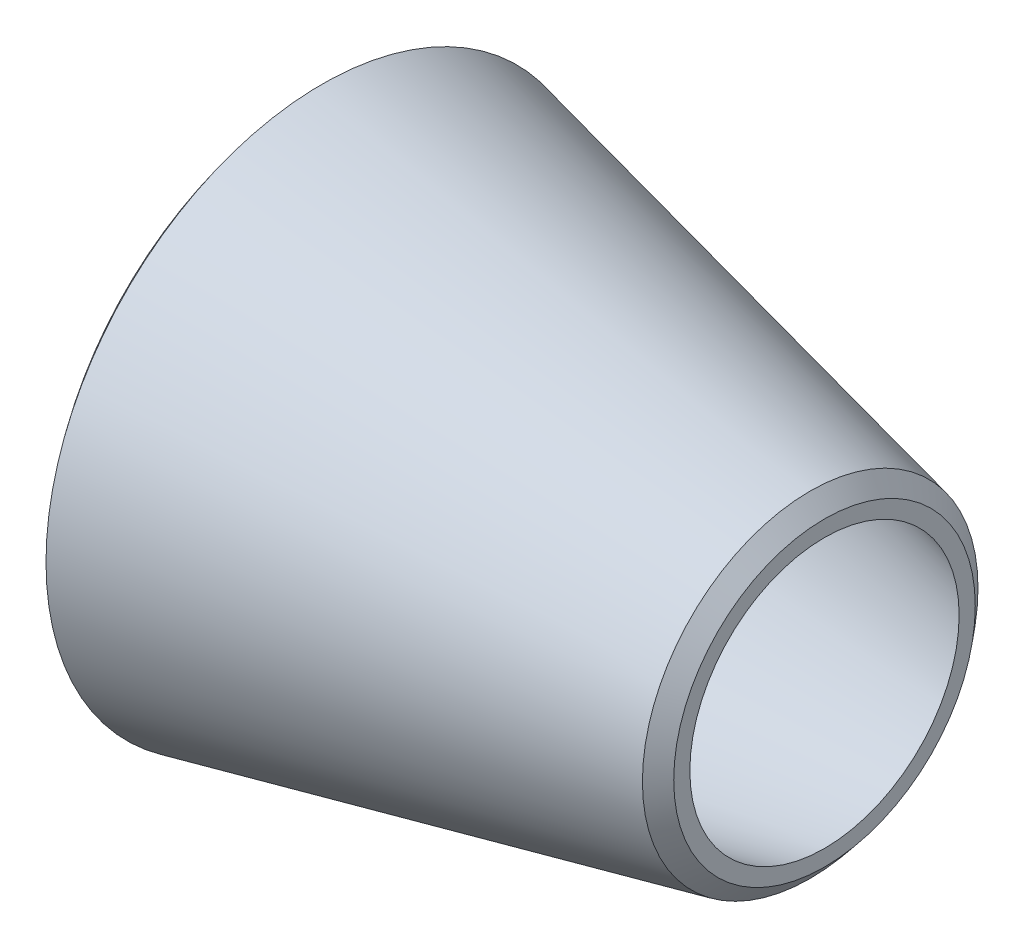
ISO-10303-21;
HEADER;
FILE_DESCRIPTION(('STEP AP214'),'2;1');
FILE_NAME('part.step','',(''),(''),'','','');
FILE_SCHEMA(('AUTOMOTIVE_DESIGN { 1 0 10303 214 1 1 1 1 }'));
ENDSEC;
DATA;
#1=APPLICATION_CONTEXT('core data for automotive mechanical design processes');
#2=APPLICATION_PROTOCOL_DEFINITION('international standard','automotive_design',2000,#1);
#3=PRODUCT_CONTEXT('',#1,'mechanical');
#4=PRODUCT('Part','Part','',(#3));
#5=PRODUCT_RELATED_PRODUCT_CATEGORY('part','',(#4));
#6=PRODUCT_DEFINITION_FORMATION('','',#4);
#7=PRODUCT_DEFINITION_CONTEXT('part definition',#1,'design');
#8=PRODUCT_DEFINITION('design','',#6,#7);
#9=PRODUCT_DEFINITION_SHAPE('','',#8);
#10=(LENGTH_UNIT() NAMED_UNIT(*) SI_UNIT(.MILLI.,.METRE.));
#11=(NAMED_UNIT(*) PLANE_ANGLE_UNIT() SI_UNIT($,.RADIAN.));
#12=(NAMED_UNIT(*) SI_UNIT($,.STERADIAN.) SOLID_ANGLE_UNIT());
#13=UNCERTAINTY_MEASURE_WITH_UNIT(LENGTH_MEASURE(1.E-05),#10,'distance_accuracy_value','');
#14=(GEOMETRIC_REPRESENTATION_CONTEXT(3) GLOBAL_UNCERTAINTY_ASSIGNED_CONTEXT((#13)) GLOBAL_UNIT_ASSIGNED_CONTEXT((#10,
#11,#12)) REPRESENTATION_CONTEXT('',''));
#15=CARTESIAN_POINT('',(0.,0.,0.));
#16=DIRECTION('',(0.,0.,1.));
#17=DIRECTION('',(1.,0.,0.));
#18=AXIS2_PLACEMENT_3D('',#15,#16,#17);
#19=CARTESIAN_POINT('',(70.,0.,0.));
#20=DIRECTION('',(1.,0.,0.));
#21=DIRECTION('',(0.,0.,-1.));
#22=AXIS2_PLACEMENT_3D('',#19,#20,#21);
#23=PLANE('',#22);
#24=CARTESIAN_POINT('',(70.,0.,0.));
#25=DIRECTION('',(1.,0.,0.));
#26=DIRECTION('',(0.,0.,-1.));
#27=AXIS2_PLACEMENT_3D('',#24,#25,#26);
#28=CIRCLE('',#27,20.6064429969785);
#29=CARTESIAN_POINT('',(70.,0.,-20.6064429969785));
#30=VERTEX_POINT('',#29);
#31=EDGE_CURVE('E74',#30,#30,#28,.T.);
#32=ORIENTED_EDGE('',*,*,#31,.T.);
#33=EDGE_LOOP('',(#32));
#34=FACE_BOUND('',#33,.T.);
#35=CARTESIAN_POINT('',(70.,0.,0.));
#36=DIRECTION('',(1.,0.,0.));
#37=DIRECTION('',(0.,0.,-1.));
#38=AXIS2_PLACEMENT_3D('',#35,#36,#37);
#39=CIRCLE('',#38,18.4031121816776);
#40=CARTESIAN_POINT('',(70.,0.,-18.4031121816776));
#41=VERTEX_POINT('',#40);
#42=EDGE_CURVE('E80',#41,#41,#39,.T.);
#43=ORIENTED_EDGE('',*,*,#42,.F.);
#44=EDGE_LOOP('',(#43));
#45=FACE_BOUND('',#44,.T.);
#46=ADVANCED_FACE('F59',(#34,#45),#23,.T.);
#47=CARTESIAN_POINT('',(0.,0.,0.));
#48=DIRECTION('',(1.,0.,0.));
#49=DIRECTION('',(0.,0.,-1.));
#50=AXIS2_PLACEMENT_3D('',#47,#48,#49);
#51=PLANE('',#50);
#52=CARTESIAN_POINT('',(0.,0.,0.));
#53=DIRECTION('',(1.,0.,0.));
#54=DIRECTION('',(0.,0.,-1.));
#55=AXIS2_PLACEMENT_3D('',#52,#53,#54);
#56=CIRCLE('',#55,36.);
#57=CARTESIAN_POINT('',(0.,0.,-36.));
#58=VERTEX_POINT('',#57);
#59=EDGE_CURVE('E12',#58,#58,#56,.F.);
#60=ORIENTED_EDGE('',*,*,#59,.T.);
#61=EDGE_LOOP('',(#60));
#62=FACE_BOUND('',#61,.T.);
#63=CARTESIAN_POINT('',(0.,0.,0.));
#64=DIRECTION('',(1.,0.,0.));
#65=DIRECTION('',(0.,0.,-1.));
#66=AXIS2_PLACEMENT_3D('',#63,#64,#65);
#67=CIRCLE('',#66,33.9031121816776);
#68=CARTESIAN_POINT('',(0.,0.,-33.9031121816776));
#69=VERTEX_POINT('',#68);
#70=EDGE_CURVE('E79',#69,#69,#67,.T.);
#71=ORIENTED_EDGE('',*,*,#70,.T.);
#72=EDGE_LOOP('',(#71));
#73=FACE_BOUND('',#72,.T.);
#74=ADVANCED_FACE('F86',(#62,#73),#51,.F.);
#75=CARTESIAN_POINT('',(0.,0.,0.));
#76=DIRECTION('',(-1.,0.,0.));
#77=DIRECTION('',(0.,0.,1.));
#78=AXIS2_PLACEMENT_3D('',#75,#76,#77);
#79=CONICAL_SURFACE('',#78,38.,0.217912516366172);
#80=CARTESIAN_POINT('',(68.0472982530247,0.,0.));
#81=DIRECTION('',(1.,0.,0.));
#82=DIRECTION('',(0.,0.,-1.));
#83=AXIS2_PLACEMENT_3D('',#80,#81,#82);
#84=CIRCLE('',#83,22.9323839582588);
#85=CARTESIAN_POINT('',(68.0472982530247,0.,-22.9323839582588));
#86=VERTEX_POINT('',#85);
#87=EDGE_CURVE('E66',#86,#86,#84,.F.);
#88=ORIENTED_EDGE('',*,*,#87,.T.);
#89=EDGE_LOOP('',(#88));
#90=FACE_BOUND('',#89,.T.);
#91=CARTESIAN_POINT('',(1.31177307973182,0.,0.));
#92=DIRECTION('',(-1.,0.,0.));
#93=DIRECTION('',(0.,0.,1.));
#94=AXIS2_PLACEMENT_3D('',#91,#92,#93);
#95=CIRCLE('',#94,37.7095359609165);
#96=CARTESIAN_POINT('',(1.31177307973182,0.,37.7095359609165));
#97=VERTEX_POINT('',#96);
#98=EDGE_CURVE('E70',#97,#97,#95,.F.);
#99=ORIENTED_EDGE('',*,*,#98,.T.);
#100=EDGE_LOOP('',(#99));
#101=FACE_BOUND('',#100,.T.);
#102=ADVANCED_FACE('F92',(#90,#101),#79,.T.);
#103=CARTESIAN_POINT('',(-0.864767916517638,0.,0.));
#104=DIRECTION('',(-1.,0.,0.));
#105=DIRECTION('',(0.,0.,1.));
#106=AXIS2_PLACEMENT_3D('',#103,#104,#105);
#107=CONICAL_SURFACE('',#106,34.0945965060494,0.217912516366172);
#108=ORIENTED_EDGE('',*,*,#70,.F.);
#109=EDGE_LOOP('',(#108));
#110=FACE_BOUND('',#109,.T.);
#111=ORIENTED_EDGE('',*,*,#42,.T.);
#112=EDGE_LOOP('',(#111));
#113=FACE_BOUND('',#112,.T.);
#114=ADVANCED_FACE('F88',(#110,#113),#107,.F.);
#115=CARTESIAN_POINT('',(70.,0.,0.));
#116=DIRECTION('',(-1.,0.,0.));
#117=DIRECTION('',(0.,0.,1.));
#118=AXIS2_PLACEMENT_3D('',#115,#116,#117);
#119=CONICAL_SURFACE('',#118,20.6064429969785,0.872410985864043);
#120=ORIENTED_EDGE('',*,*,#87,.F.);
#121=EDGE_LOOP('',(#120));
#122=FACE_BOUND('',#121,.T.);
#123=ORIENTED_EDGE('',*,*,#31,.F.);
#124=EDGE_LOOP('',(#123));
#125=FACE_BOUND('',#124,.T.);
#126=ADVANCED_FACE('F91',(#122,#125),#119,.T.);
#127=CARTESIAN_POINT('',(1.31177307973181,0.,0.));
#128=DIRECTION('',(1.,0.,0.));
#129=DIRECTION('',(0.,0.,-1.));
#130=AXIS2_PLACEMENT_3D('',#127,#128,#129);
#131=CONICAL_SURFACE('',#130,37.7095359609165,0.916297857297018);
#132=ORIENTED_EDGE('',*,*,#59,.F.);
#133=EDGE_LOOP('',(#132));
#134=FACE_BOUND('',#133,.T.);
#135=ORIENTED_EDGE('',*,*,#98,.F.);
#136=EDGE_LOOP('',(#135));
#137=FACE_BOUND('',#136,.T.);
#138=ADVANCED_FACE('F61',(#134,#137),#131,.T.);
#139=CLOSED_SHELL('',(#46,#74,#102,#114,#126,#138));
#140=MANIFOLD_SOLID_BREP('B2',#139);
#141=ADVANCED_BREP_SHAPE_REPRESENTATION('',(#18,#140),#14);
#142=SHAPE_DEFINITION_REPRESENTATION(#9,#141);
ENDSEC;
END-ISO-10303-21;
